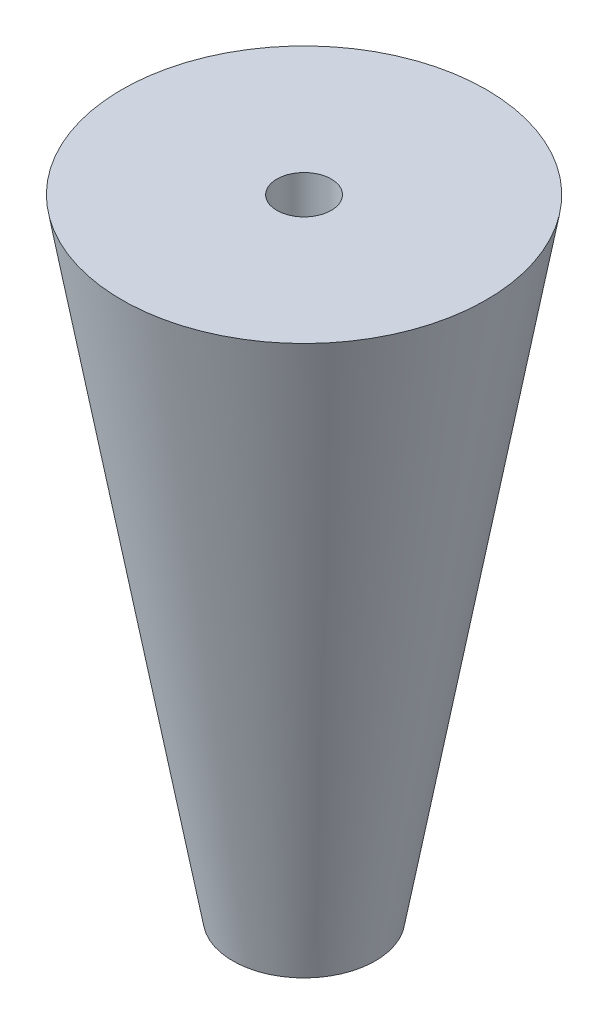
ISO-10303-21;
HEADER;
FILE_DESCRIPTION(('STEP AP214'),'2;1');
FILE_NAME('part.step','',(''),(''),'','','');
FILE_SCHEMA(('AUTOMOTIVE_DESIGN { 1 0 10303 214 1 1 1 1 }'));
ENDSEC;
DATA;
#1=APPLICATION_CONTEXT('core data for automotive mechanical design processes');
#2=APPLICATION_PROTOCOL_DEFINITION('international standard','automotive_design',2000,#1);
#3=PRODUCT_CONTEXT('',#1,'mechanical');
#4=PRODUCT('Part','Part','',(#3));
#5=PRODUCT_RELATED_PRODUCT_CATEGORY('part','',(#4));
#6=PRODUCT_DEFINITION_FORMATION('','',#4);
#7=PRODUCT_DEFINITION_CONTEXT('part definition',#1,'design');
#8=PRODUCT_DEFINITION('design','',#6,#7);
#9=PRODUCT_DEFINITION_SHAPE('','',#8);
#10=(LENGTH_UNIT() NAMED_UNIT(*) SI_UNIT(.MILLI.,.METRE.));
#11=(NAMED_UNIT(*) PLANE_ANGLE_UNIT() SI_UNIT($,.RADIAN.));
#12=(NAMED_UNIT(*) SI_UNIT($,.STERADIAN.) SOLID_ANGLE_UNIT());
#13=UNCERTAINTY_MEASURE_WITH_UNIT(LENGTH_MEASURE(1.E-05),#10,'distance_accuracy_value','');
#14=(GEOMETRIC_REPRESENTATION_CONTEXT(3) GLOBAL_UNCERTAINTY_ASSIGNED_CONTEXT((#13)) GLOBAL_UNIT_ASSIGNED_CONTEXT((#10,
#11,#12)) REPRESENTATION_CONTEXT('',''));
#15=CARTESIAN_POINT('',(0.,0.,0.));
#16=DIRECTION('',(0.,0.,1.));
#17=DIRECTION('',(1.,0.,0.));
#18=AXIS2_PLACEMENT_3D('',#15,#16,#17);
#19=CARTESIAN_POINT('',(103.959316021066,23.7330164905591,0.));
#20=DIRECTION('',(0.,1.,0.));
#21=DIRECTION('',(0.,0.,1.));
#22=AXIS2_PLACEMENT_3D('',#19,#20,#21);
#23=PLANE('',#22);
#24=CARTESIAN_POINT('',(116.442965696214,23.7330164905591,0.));
#25=DIRECTION('',(0.,-1.,0.));
#26=DIRECTION('',(0.,0.,-1.));
#27=AXIS2_PLACEMENT_3D('',#24,#25,#26);
#28=CIRCLE('',#27,4.7625);
#29=CARTESIAN_POINT('',(116.442965696214,23.7330164905591,-4.7625));
#30=VERTEX_POINT('',#29);
#31=EDGE_CURVE('E45',#30,#30,#28,.T.);
#32=ORIENTED_EDGE('',*,*,#31,.F.);
#33=EDGE_LOOP('',(#32));
#34=FACE_BOUND('',#33,.T.);
#35=CARTESIAN_POINT('',(116.442965696214,23.7330164905591,0.));
#36=DIRECTION('',(0.,-1.,0.));
#37=DIRECTION('',(0.,0.,-1.));
#38=AXIS2_PLACEMENT_3D('',#35,#36,#37);
#39=CIRCLE('',#38,12.4836496751481);
#40=CARTESIAN_POINT('',(116.442965696214,23.7330164905591,-12.4836496751481));
#41=VERTEX_POINT('',#40);
#42=EDGE_CURVE('E37',#41,#41,#39,.T.);
#43=ORIENTED_EDGE('',*,*,#42,.T.);
#44=EDGE_LOOP('',(#43));
#45=FACE_BOUND('',#44,.T.);
#46=ADVANCED_FACE('F31',(#34,#45),#23,.F.);
#47=CARTESIAN_POINT('',(116.442965696214,133.658487241169,0.));
#48=DIRECTION('',(0.,-1.,0.));
#49=DIRECTION('',(0.,0.,-1.));
#50=AXIS2_PLACEMENT_3D('',#47,#48,#49);
#51=PLANE('',#50);
#52=CARTESIAN_POINT('',(116.442965696214,133.658487241169,0.));
#53=DIRECTION('',(0.,-1.,0.));
#54=DIRECTION('',(0.,0.,-1.));
#55=AXIS2_PLACEMENT_3D('',#52,#53,#54);
#56=CIRCLE('',#55,4.7625);
#57=CARTESIAN_POINT('',(116.442965696214,133.658487241169,-4.7625));
#58=VERTEX_POINT('',#57);
#59=EDGE_CURVE('E41',#58,#58,#56,.T.);
#60=ORIENTED_EDGE('',*,*,#59,.T.);
#61=EDGE_LOOP('',(#60));
#62=FACE_BOUND('',#61,.T.);
#63=CARTESIAN_POINT('',(116.442965696214,133.658487241169,0.));
#64=DIRECTION('',(0.,-1.,0.));
#65=DIRECTION('',(0.,0.,-1.));
#66=AXIS2_PLACEMENT_3D('',#63,#64,#65);
#67=CIRCLE('',#66,31.9026602809341);
#68=CARTESIAN_POINT('',(116.442965696214,133.658487241169,-31.9026602809341));
#69=VERTEX_POINT('',#68);
#70=EDGE_CURVE('E10',#69,#69,#67,.T.);
#71=ORIENTED_EDGE('',*,*,#70,.F.);
#72=EDGE_LOOP('',(#71));
#73=FACE_BOUND('',#72,.T.);
#74=ADVANCED_FACE('F54',(#62,#73),#51,.F.);
#75=CARTESIAN_POINT('',(116.442965696214,133.658487241169,0.));
#76=DIRECTION('',(0.,1.,0.));
#77=DIRECTION('',(0.,0.,1.));
#78=AXIS2_PLACEMENT_3D('',#75,#76,#77);
#79=CONICAL_SURFACE('',#78,31.9026602809341,0.174852152218462);
#80=ORIENTED_EDGE('',*,*,#42,.F.);
#81=EDGE_LOOP('',(#80));
#82=FACE_BOUND('',#81,.T.);
#83=ORIENTED_EDGE('',*,*,#70,.T.);
#84=EDGE_LOOP('',(#83));
#85=FACE_BOUND('',#84,.T.);
#86=ADVANCED_FACE('F58',(#82,#85),#79,.T.);
#87=CARTESIAN_POINT('',(116.442965696214,133.658487241169,0.));
#88=DIRECTION('',(0.,-1.,0.));
#89=DIRECTION('',(0.,0.,-1.));
#90=AXIS2_PLACEMENT_3D('',#87,#88,#89);
#91=CYLINDRICAL_SURFACE('',#90,4.7625);
#92=ORIENTED_EDGE('',*,*,#59,.F.);
#93=EDGE_LOOP('',(#92));
#94=FACE_BOUND('',#93,.T.);
#95=ORIENTED_EDGE('',*,*,#31,.T.);
#96=EDGE_LOOP('',(#95));
#97=FACE_BOUND('',#96,.T.);
#98=ADVANCED_FACE('F51',(#94,#97),#91,.F.);
#99=CLOSED_SHELL('',(#46,#74,#86,#98));
#100=MANIFOLD_SOLID_BREP('B2',#99);
#101=ADVANCED_BREP_SHAPE_REPRESENTATION('',(#18,#100),#14);
#102=SHAPE_DEFINITION_REPRESENTATION(#9,#101);
ENDSEC;
END-ISO-10303-21;
